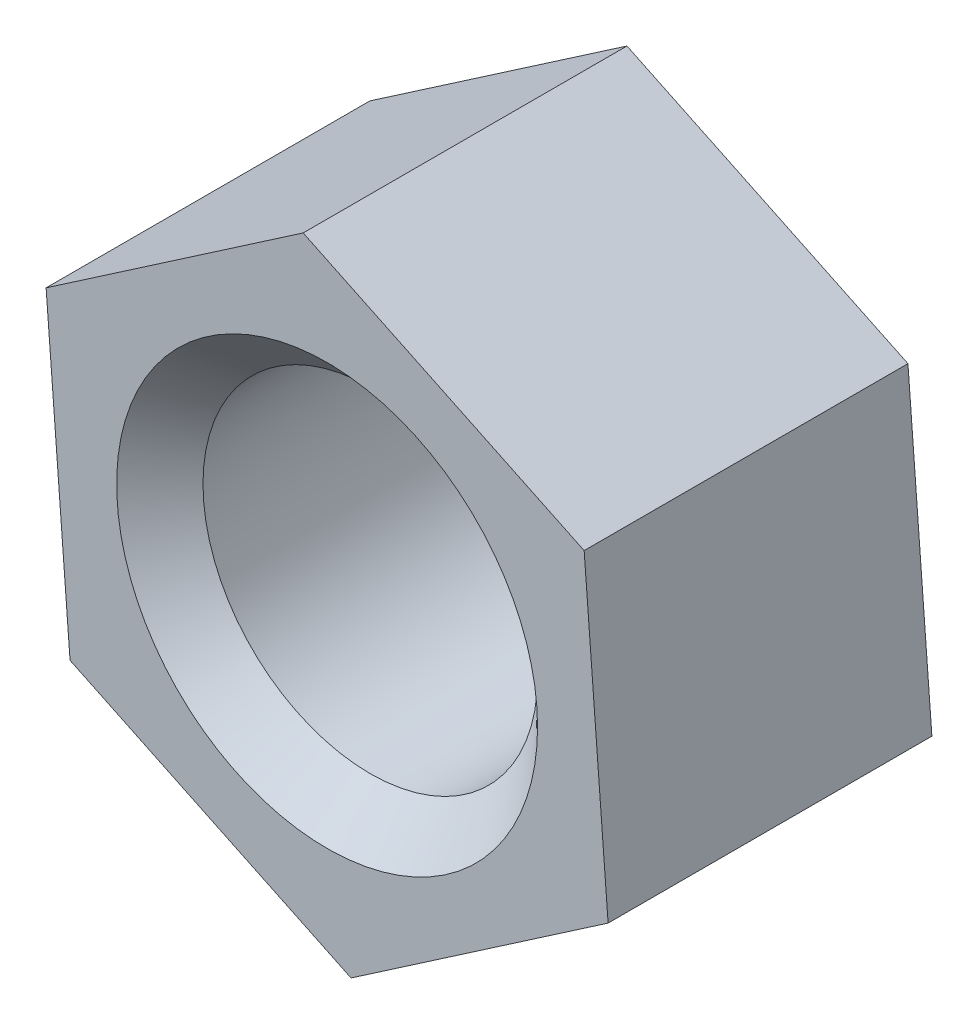
ISO-10303-21;
HEADER;
FILE_DESCRIPTION(('STEP AP214'),'2;1');
FILE_NAME('part.step','',(''),(''),'','','');
FILE_SCHEMA(('AUTOMOTIVE_DESIGN { 1 0 10303 214 1 1 1 1 }'));
ENDSEC;
DATA;
#1=APPLICATION_CONTEXT('core data for automotive mechanical design processes');
#2=APPLICATION_PROTOCOL_DEFINITION('international standard','automotive_design',2000,#1);
#3=PRODUCT_CONTEXT('',#1,'mechanical');
#4=PRODUCT('Part','Part','',(#3));
#5=PRODUCT_RELATED_PRODUCT_CATEGORY('part','',(#4));
#6=PRODUCT_DEFINITION_FORMATION('','',#4);
#7=PRODUCT_DEFINITION_CONTEXT('part definition',#1,'design');
#8=PRODUCT_DEFINITION('design','',#6,#7);
#9=PRODUCT_DEFINITION_SHAPE('','',#8);
#10=(LENGTH_UNIT() NAMED_UNIT(*) SI_UNIT(.MILLI.,.METRE.));
#11=(NAMED_UNIT(*) PLANE_ANGLE_UNIT() SI_UNIT($,.RADIAN.));
#12=(NAMED_UNIT(*) SI_UNIT($,.STERADIAN.) SOLID_ANGLE_UNIT());
#13=UNCERTAINTY_MEASURE_WITH_UNIT(LENGTH_MEASURE(1.E-05),#10,'distance_accuracy_value','');
#14=(GEOMETRIC_REPRESENTATION_CONTEXT(3) GLOBAL_UNCERTAINTY_ASSIGNED_CONTEXT((#13)) GLOBAL_UNIT_ASSIGNED_CONTEXT((#10,
#11,#12)) REPRESENTATION_CONTEXT('',''));
#15=CARTESIAN_POINT('',(0.,0.,0.));
#16=DIRECTION('',(0.,0.,1.));
#17=DIRECTION('',(1.,0.,0.));
#18=AXIS2_PLACEMENT_3D('',#15,#16,#17);
#19=CARTESIAN_POINT('',(1.10936120204747,-14.3910614986083,15.));
#20=DIRECTION('',(-0.565082665931605,0.825034290598658,0.));
#21=DIRECTION('',(-0.825034290598658,-0.565082665931605,0.));
#22=AXIS2_PLACEMENT_3D('',#19,#20,#21);
#23=PLANE('',#22);
#24=DIRECTION('',(0.825034290598658,0.565082665931605,0.));
#25=VECTOR('',#24,1.);
#26=CARTESIAN_POINT('',(1.10936120204747,-14.3910614986083,0.));
#27=LINE('',#26,#25);
#28=CARTESIAN_POINT('',(1.10936120204747,-14.3910614986083,0.));
#29=VERTEX_POINT('',#28);
#30=CARTESIAN_POINT('',(13.0177054462426,-6.23479576635818,0.));
#31=VERTEX_POINT('',#30);
#32=EDGE_CURVE('E118',#29,#31,#27,.T.);
#33=ORIENTED_EDGE('',*,*,#32,.T.);
#34=DIRECTION('',(0.,0.,-1.));
#35=VECTOR('',#34,1.);
#36=CARTESIAN_POINT('',(13.0177054462426,-6.23479576635818,15.));
#37=LINE('',#36,#35);
#38=CARTESIAN_POINT('',(13.0177054462426,-6.23479576635818,15.));
#39=VERTEX_POINT('',#38);
#40=EDGE_CURVE('E135',#39,#31,#37,.T.);
#41=ORIENTED_EDGE('',*,*,#40,.F.);
#42=DIRECTION('',(0.825034290598658,0.565082665931605,0.));
#43=VECTOR('',#42,1.);
#44=CARTESIAN_POINT('',(1.10936120204747,-14.3910614986083,15.));
#45=LINE('',#44,#43);
#46=CARTESIAN_POINT('',(1.10936120204747,-14.3910614986083,15.));
#47=VERTEX_POINT('',#46);
#48=EDGE_CURVE('E128',#47,#39,#45,.T.);
#49=ORIENTED_EDGE('',*,*,#48,.F.);
#50=DIRECTION('',(0.,0.,-1.));
#51=VECTOR('',#50,1.);
#52=CARTESIAN_POINT('',(1.10936120204747,-14.3910614986083,15.));
#53=LINE('',#52,#51);
#54=EDGE_CURVE('E114',#47,#29,#53,.T.);
#55=ORIENTED_EDGE('',*,*,#54,.T.);
#56=EDGE_LOOP('',(#33,#41,#49,#55));
#57=FACE_BOUND('',#56,.T.);
#58=ADVANCED_FACE('F32',(#57),#23,.F.);
#59=CARTESIAN_POINT('',(13.0177054462426,-6.23479576635818,15.));
#60=DIRECTION('',(-0.997041987617513,-0.0768587986356758,0.));
#61=DIRECTION('',(0.0768587986356758,-0.997041987617513,0.));
#62=AXIS2_PLACEMENT_3D('',#59,#60,#61);
#63=PLANE('',#62);
#64=DIRECTION('',(-0.0768587986356758,0.997041987617513,0.));
#65=VECTOR('',#64,1.);
#66=CARTESIAN_POINT('',(13.0177054462426,-6.23479576635818,0.));
#67=LINE('',#66,#65);
#68=CARTESIAN_POINT('',(11.9083442441952,8.15626573225008,0.));
#69=VERTEX_POINT('',#68);
#70=EDGE_CURVE('E121',#31,#69,#67,.T.);
#71=ORIENTED_EDGE('',*,*,#70,.T.);
#72=DIRECTION('',(0.,0.,-1.));
#73=VECTOR('',#72,1.);
#74=CARTESIAN_POINT('',(11.9083442441952,8.15626573225008,15.));
#75=LINE('',#74,#73);
#76=CARTESIAN_POINT('',(11.9083442441952,8.15626573225008,15.));
#77=VERTEX_POINT('',#76);
#78=EDGE_CURVE('E132',#77,#69,#75,.T.);
#79=ORIENTED_EDGE('',*,*,#78,.F.);
#80=DIRECTION('',(-0.0768587986356758,0.997041987617513,0.));
#81=VECTOR('',#80,1.);
#82=CARTESIAN_POINT('',(13.0177054462426,-6.23479576635818,15.));
#83=LINE('',#82,#81);
#84=EDGE_CURVE('E87',#39,#77,#83,.T.);
#85=ORIENTED_EDGE('',*,*,#84,.F.);
#86=ORIENTED_EDGE('',*,*,#40,.T.);
#87=EDGE_LOOP('',(#71,#79,#85,#86));
#88=FACE_BOUND('',#87,.T.);
#89=ADVANCED_FACE('F173',(#88),#63,.F.);
#90=CARTESIAN_POINT('',(11.9083442441952,8.15626573225008,15.));
#91=DIRECTION('',(-0.431959321685909,-0.901893089234334,0.));
#92=DIRECTION('',(0.901893089234334,-0.431959321685909,0.));
#93=AXIS2_PLACEMENT_3D('',#90,#91,#92);
#94=PLANE('',#93);
#95=DIRECTION('',(-0.901893089234334,0.431959321685909,0.));
#96=VECTOR('',#95,1.);
#97=CARTESIAN_POINT('',(11.9083442441952,8.15626573225008,0.));
#98=LINE('',#97,#96);
#99=CARTESIAN_POINT('',(-1.10936120204747,14.3910614986083,0.));
#100=VERTEX_POINT('',#99);
#101=EDGE_CURVE('E123',#69,#100,#98,.T.);
#102=ORIENTED_EDGE('',*,*,#101,.T.);
#103=DIRECTION('',(0.,0.,-1.));
#104=VECTOR('',#103,1.);
#105=CARTESIAN_POINT('',(-1.10936120204747,14.3910614986083,15.));
#106=LINE('',#105,#104);
#107=CARTESIAN_POINT('',(-1.10936120204747,14.3910614986083,15.));
#108=VERTEX_POINT('',#107);
#109=EDGE_CURVE('E109',#108,#100,#106,.T.);
#110=ORIENTED_EDGE('',*,*,#109,.F.);
#111=DIRECTION('',(-0.901893089234334,0.431959321685909,0.));
#112=VECTOR('',#111,1.);
#113=CARTESIAN_POINT('',(11.9083442441952,8.15626573225008,15.));
#114=LINE('',#113,#112);
#115=EDGE_CURVE('E100',#77,#108,#114,.T.);
#116=ORIENTED_EDGE('',*,*,#115,.F.);
#117=ORIENTED_EDGE('',*,*,#78,.T.);
#118=EDGE_LOOP('',(#102,#110,#116,#117));
#119=FACE_BOUND('',#118,.T.);
#120=ADVANCED_FACE('F179',(#119),#94,.F.);
#121=CARTESIAN_POINT('',(-1.10936120204747,14.3910614986083,15.));
#122=DIRECTION('',(0.565082665931604,-0.825034290598658,0.));
#123=DIRECTION('',(0.825034290598658,0.565082665931604,0.));
#124=AXIS2_PLACEMENT_3D('',#121,#122,#123);
#125=PLANE('',#124);
#126=DIRECTION('',(-0.825034290598658,-0.565082665931604,0.));
#127=VECTOR('',#126,1.);
#128=CARTESIAN_POINT('',(-1.10936120204747,14.3910614986083,0.));
#129=LINE('',#128,#127);
#130=CARTESIAN_POINT('',(-13.0177054462426,6.23479576635819,0.));
#131=VERTEX_POINT('',#130);
#132=EDGE_CURVE('E108',#100,#131,#129,.T.);
#133=ORIENTED_EDGE('',*,*,#132,.T.);
#134=DIRECTION('',(0.,0.,-1.));
#135=VECTOR('',#134,1.);
#136=CARTESIAN_POINT('',(-13.0177054462426,6.23479576635819,15.));
#137=LINE('',#136,#135);
#138=CARTESIAN_POINT('',(-13.0177054462426,6.23479576635819,15.));
#139=VERTEX_POINT('',#138);
#140=EDGE_CURVE('E105',#139,#131,#137,.T.);
#141=ORIENTED_EDGE('',*,*,#140,.F.);
#142=DIRECTION('',(-0.825034290598658,-0.565082665931604,0.));
#143=VECTOR('',#142,1.);
#144=CARTESIAN_POINT('',(-1.10936120204747,14.3910614986083,15.));
#145=LINE('',#144,#143);
#146=EDGE_CURVE('E94',#108,#139,#145,.T.);
#147=ORIENTED_EDGE('',*,*,#146,.F.);
#148=ORIENTED_EDGE('',*,*,#109,.T.);
#149=EDGE_LOOP('',(#133,#141,#147,#148));
#150=FACE_BOUND('',#149,.T.);
#151=ADVANCED_FACE('F106',(#150),#125,.F.);
#152=CARTESIAN_POINT('',(-13.0177054462426,6.23479576635819,15.));
#153=DIRECTION('',(0.997041987617513,0.0768587986356759,0.));
#154=DIRECTION('',(-0.0768587986356759,0.997041987617513,0.));
#155=AXIS2_PLACEMENT_3D('',#152,#153,#154);
#156=PLANE('',#155);
#157=DIRECTION('',(0.0768587986356759,-0.997041987617513,0.));
#158=VECTOR('',#157,1.);
#159=CARTESIAN_POINT('',(-13.0177054462426,6.23479576635819,0.));
#160=LINE('',#159,#158);
#161=CARTESIAN_POINT('',(-11.9083442441952,-8.15626573225008,0.));
#162=VERTEX_POINT('',#161);
#163=EDGE_CURVE('E72',#131,#162,#160,.T.);
#164=ORIENTED_EDGE('',*,*,#163,.T.);
#165=DIRECTION('',(0.,0.,-1.));
#166=VECTOR('',#165,1.);
#167=CARTESIAN_POINT('',(-11.9083442441952,-8.15626573225008,15.));
#168=LINE('',#167,#166);
#169=CARTESIAN_POINT('',(-11.9083442441952,-8.15626573225008,15.));
#170=VERTEX_POINT('',#169);
#171=EDGE_CURVE('E110',#170,#162,#168,.T.);
#172=ORIENTED_EDGE('',*,*,#171,.F.);
#173=DIRECTION('',(0.0768587986356759,-0.997041987617513,0.));
#174=VECTOR('',#173,1.);
#175=CARTESIAN_POINT('',(-13.0177054462426,6.23479576635819,15.));
#176=LINE('',#175,#174);
#177=EDGE_CURVE('E98',#139,#170,#176,.T.);
#178=ORIENTED_EDGE('',*,*,#177,.F.);
#179=ORIENTED_EDGE('',*,*,#140,.T.);
#180=EDGE_LOOP('',(#164,#172,#178,#179));
#181=FACE_BOUND('',#180,.T.);
#182=ADVANCED_FACE('F112',(#181),#156,.F.);
#183=CARTESIAN_POINT('',(-11.9083442441952,-8.15626573225008,15.));
#184=DIRECTION('',(0.431959321685909,0.901893089234334,0.));
#185=DIRECTION('',(-0.901893089234334,0.431959321685909,0.));
#186=AXIS2_PLACEMENT_3D('',#183,#184,#185);
#187=PLANE('',#186);
#188=DIRECTION('',(0.901893089234334,-0.431959321685909,0.));
#189=VECTOR('',#188,1.);
#190=CARTESIAN_POINT('',(-11.9083442441952,-8.15626573225008,0.));
#191=LINE('',#190,#189);
#192=EDGE_CURVE('E78',#162,#29,#191,.T.);
#193=ORIENTED_EDGE('',*,*,#192,.T.);
#194=ORIENTED_EDGE('',*,*,#54,.F.);
#195=DIRECTION('',(0.901893089234334,-0.431959321685909,0.));
#196=VECTOR('',#195,1.);
#197=CARTESIAN_POINT('',(-11.9083442441952,-8.15626573225008,15.));
#198=LINE('',#197,#196);
#199=EDGE_CURVE('E49',#170,#47,#198,.T.);
#200=ORIENTED_EDGE('',*,*,#199,.F.);
#201=ORIENTED_EDGE('',*,*,#171,.T.);
#202=EDGE_LOOP('',(#193,#194,#200,#201));
#203=FACE_BOUND('',#202,.T.);
#204=ADVANCED_FACE('F164',(#203),#187,.F.);
#205=CARTESIAN_POINT('',(0.,0.,15.));
#206=DIRECTION('',(0.,0.,1.));
#207=DIRECTION('',(1.,0.,0.));
#208=AXIS2_PLACEMENT_3D('',#205,#206,#207);
#209=PLANE('',#208);
#210=CARTESIAN_POINT('',(0.,0.,15.));
#211=DIRECTION('',(0.,0.,1.));
#212=DIRECTION('',(1.,0.,0.));
#213=AXIS2_PLACEMENT_3D('',#210,#211,#212);
#214=CIRCLE('',#213,9.74999999999999);
#215=CARTESIAN_POINT('',(9.74999999999999,0.,15.));
#216=VERTEX_POINT('',#215);
#217=EDGE_CURVE('E11',#216,#216,#214,.F.);
#218=ORIENTED_EDGE('',*,*,#217,.T.);
#219=EDGE_LOOP('',(#218));
#220=FACE_BOUND('',#219,.T.);
#221=ORIENTED_EDGE('',*,*,#48,.T.);
#222=ORIENTED_EDGE('',*,*,#84,.T.);
#223=ORIENTED_EDGE('',*,*,#115,.T.);
#224=ORIENTED_EDGE('',*,*,#146,.T.);
#225=ORIENTED_EDGE('',*,*,#177,.T.);
#226=ORIENTED_EDGE('',*,*,#199,.T.);
#227=EDGE_LOOP('',(#221,#222,#223,#224,#225,#226));
#228=FACE_BOUND('',#227,.T.);
#229=ADVANCED_FACE('F96',(#220,#228),#209,.T.);
#230=CARTESIAN_POINT('',(0.,0.,0.));
#231=DIRECTION('',(0.,0.,1.));
#232=DIRECTION('',(1.,0.,0.));
#233=AXIS2_PLACEMENT_3D('',#230,#231,#232);
#234=PLANE('',#233);
#235=CARTESIAN_POINT('',(0.,0.,0.));
#236=DIRECTION('',(0.,0.,1.));
#237=DIRECTION('',(1.,0.,0.));
#238=AXIS2_PLACEMENT_3D('',#235,#236,#237);
#239=CIRCLE('',#238,9.75);
#240=CARTESIAN_POINT('',(9.75,0.,0.));
#241=VERTEX_POINT('',#240);
#242=EDGE_CURVE('E41',#241,#241,#239,.T.);
#243=ORIENTED_EDGE('',*,*,#242,.T.);
#244=EDGE_LOOP('',(#243));
#245=FACE_BOUND('',#244,.T.);
#246=ORIENTED_EDGE('',*,*,#32,.F.);
#247=ORIENTED_EDGE('',*,*,#192,.F.);
#248=ORIENTED_EDGE('',*,*,#163,.F.);
#249=ORIENTED_EDGE('',*,*,#132,.F.);
#250=ORIENTED_EDGE('',*,*,#101,.F.);
#251=ORIENTED_EDGE('',*,*,#70,.F.);
#252=EDGE_LOOP('',(#246,#247,#248,#249,#250,#251));
#253=FACE_BOUND('',#252,.T.);
#254=ADVANCED_FACE('F145',(#245,#253),#234,.F.);
#255=CARTESIAN_POINT('',(0.,0.,15.));
#256=DIRECTION('',(0.,0.,-1.));
#257=DIRECTION('',(-1.,0.,0.));
#258=AXIS2_PLACEMENT_3D('',#255,#256,#257);
#259=CYLINDRICAL_SURFACE('',#258,7.75);
#260=CARTESIAN_POINT('',(0.,0.,2.));
#261=DIRECTION('',(0.,0.,1.));
#262=DIRECTION('',(1.,0.,0.));
#263=AXIS2_PLACEMENT_3D('',#260,#261,#262);
#264=CIRCLE('',#263,7.75);
#265=CARTESIAN_POINT('',(7.75,0.,2.));
#266=VERTEX_POINT('',#265);
#267=EDGE_CURVE('E140',#266,#266,#264,.F.);
#268=ORIENTED_EDGE('',*,*,#267,.T.);
#269=EDGE_LOOP('',(#268));
#270=FACE_BOUND('',#269,.T.);
#271=CARTESIAN_POINT('',(0.,0.,13.));
#272=DIRECTION('',(0.,0.,1.));
#273=DIRECTION('',(1.,0.,0.));
#274=AXIS2_PLACEMENT_3D('',#271,#272,#273);
#275=CIRCLE('',#274,7.75);
#276=CARTESIAN_POINT('',(7.75,0.,13.));
#277=VERTEX_POINT('',#276);
#278=EDGE_CURVE('E137',#277,#277,#275,.T.);
#279=ORIENTED_EDGE('',*,*,#278,.T.);
#280=EDGE_LOOP('',(#279));
#281=FACE_BOUND('',#280,.T.);
#282=ADVANCED_FACE('F151',(#270,#281),#259,.F.);
#283=CARTESIAN_POINT('',(0.,0.,2.));
#284=DIRECTION('',(0.,0.,-1.));
#285=DIRECTION('',(-1.,0.,0.));
#286=AXIS2_PLACEMENT_3D('',#283,#284,#285);
#287=CONICAL_SURFACE('',#286,7.75,0.785398163397448);
#288=ORIENTED_EDGE('',*,*,#242,.F.);
#289=EDGE_LOOP('',(#288));
#290=FACE_BOUND('',#289,.T.);
#291=ORIENTED_EDGE('',*,*,#267,.F.);
#292=EDGE_LOOP('',(#291));
#293=FACE_BOUND('',#292,.T.);
#294=ADVANCED_FACE('F148',(#290,#293),#287,.F.);
#295=CARTESIAN_POINT('',(0.,0.,15.));
#296=DIRECTION('',(0.,0.,1.));
#297=DIRECTION('',(1.,0.,0.));
#298=AXIS2_PLACEMENT_3D('',#295,#296,#297);
#299=CONICAL_SURFACE('',#298,9.74999999999999,0.785398163397447);
#300=ORIENTED_EDGE('',*,*,#278,.F.);
#301=EDGE_LOOP('',(#300));
#302=FACE_BOUND('',#301,.T.);
#303=ORIENTED_EDGE('',*,*,#217,.F.);
#304=EDGE_LOOP('',(#303));
#305=FACE_BOUND('',#304,.T.);
#306=ADVANCED_FACE('F34',(#302,#305),#299,.F.);
#307=CLOSED_SHELL('',(#58,#89,#120,#151,#182,#204,#229,#254,#282,#294,#306));
#308=MANIFOLD_SOLID_BREP('B2',#307);
#309=ADVANCED_BREP_SHAPE_REPRESENTATION('',(#18,#308),#14);
#310=SHAPE_DEFINITION_REPRESENTATION(#9,#309);
ENDSEC;
END-ISO-10303-21;
